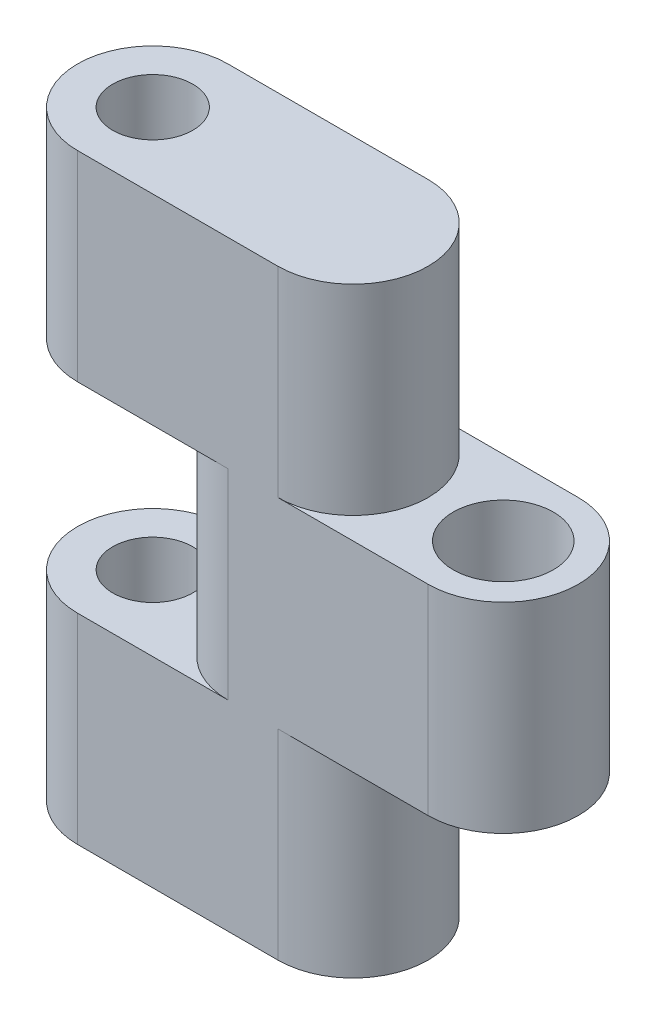
ISO-10303-21;
HEADER;
FILE_DESCRIPTION(('STEP AP214'),'2;1');
FILE_NAME('part.step','',(''),(''),'','','');
FILE_SCHEMA(('AUTOMOTIVE_DESIGN { 1 0 10303 214 1 1 1 1 }'));
ENDSEC;
DATA;
#1=APPLICATION_CONTEXT('core data for automotive mechanical design processes');
#2=APPLICATION_PROTOCOL_DEFINITION('international standard','automotive_design',2000,#1);
#3=PRODUCT_CONTEXT('',#1,'mechanical');
#4=PRODUCT('Part','Part','',(#3));
#5=PRODUCT_RELATED_PRODUCT_CATEGORY('part','',(#4));
#6=PRODUCT_DEFINITION_FORMATION('','',#4);
#7=PRODUCT_DEFINITION_CONTEXT('part definition',#1,'design');
#8=PRODUCT_DEFINITION('design','',#6,#7);
#9=PRODUCT_DEFINITION_SHAPE('','',#8);
#10=(LENGTH_UNIT() NAMED_UNIT(*) SI_UNIT(.MILLI.,.METRE.));
#11=(NAMED_UNIT(*) PLANE_ANGLE_UNIT() SI_UNIT($,.RADIAN.));
#12=(NAMED_UNIT(*) SI_UNIT($,.STERADIAN.) SOLID_ANGLE_UNIT());
#13=UNCERTAINTY_MEASURE_WITH_UNIT(LENGTH_MEASURE(1.E-05),#10,'distance_accuracy_value','');
#14=(GEOMETRIC_REPRESENTATION_CONTEXT(3) GLOBAL_UNCERTAINTY_ASSIGNED_CONTEXT((#13)) GLOBAL_UNIT_ASSIGNED_CONTEXT((#10,
#11,#12)) REPRESENTATION_CONTEXT('',''));
#15=CARTESIAN_POINT('',(0.,0.,0.));
#16=DIRECTION('',(0.,0.,1.));
#17=DIRECTION('',(1.,0.,0.));
#18=AXIS2_PLACEMENT_3D('',#15,#16,#17);
#19=CARTESIAN_POINT('',(0.,12.,1.5));
#20=DIRECTION('',(0.,-1.,0.));
#21=DIRECTION('',(0.,0.,-1.));
#22=AXIS2_PLACEMENT_3D('',#19,#20,#21);
#23=CYLINDRICAL_SURFACE('',#22,1.5);
#24=CARTESIAN_POINT('',(0.,8.,1.5));
#25=DIRECTION('',(0.,-1.,0.));
#26=DIRECTION('',(0.,0.,-1.));
#27=AXIS2_PLACEMENT_3D('',#24,#25,#26);
#28=CIRCLE('',#27,1.5);
#29=CARTESIAN_POINT('',(0.,8.,3.));
#30=VERTEX_POINT('',#29);
#31=CARTESIAN_POINT('',(0.,8.,0.));
#32=VERTEX_POINT('',#31);
#33=EDGE_CURVE('E138',#30,#32,#28,.T.);
#34=ORIENTED_EDGE('',*,*,#33,.F.);
#35=DIRECTION('',(0.,-1.,0.));
#36=VECTOR('',#35,1.);
#37=CARTESIAN_POINT('',(0.,12.,3.));
#38=LINE('',#37,#36);
#39=CARTESIAN_POINT('',(0.,12.,3.));
#40=VERTEX_POINT('',#39);
#41=EDGE_CURVE('E13',#40,#30,#38,.T.);
#42=ORIENTED_EDGE('',*,*,#41,.F.);
#43=CARTESIAN_POINT('',(0.,12.,1.5));
#44=DIRECTION('',(0.,1.,0.));
#45=DIRECTION('',(0.,0.,1.));
#46=AXIS2_PLACEMENT_3D('',#43,#44,#45);
#47=CIRCLE('',#46,1.5);
#48=CARTESIAN_POINT('',(0.,12.,0.));
#49=VERTEX_POINT('',#48);
#50=EDGE_CURVE('E161',#49,#40,#47,.T.);
#51=ORIENTED_EDGE('',*,*,#50,.F.);
#52=DIRECTION('',(0.,-1.,0.));
#53=VECTOR('',#52,1.);
#54=CARTESIAN_POINT('',(0.,12.,0.));
#55=LINE('',#54,#53);
#56=EDGE_CURVE('E148',#49,#32,#55,.T.);
#57=ORIENTED_EDGE('',*,*,#56,.T.);
#58=EDGE_LOOP('',(#34,#42,#51,#57));
#59=FACE_BOUND('',#58,.T.);
#60=ADVANCED_FACE('F46',(#59),#23,.T.);
#61=CARTESIAN_POINT('',(0.,12.,1.5));
#62=DIRECTION('',(0.,-1.,0.));
#63=DIRECTION('',(0.,0.,-1.));
#64=AXIS2_PLACEMENT_3D('',#61,#62,#63);
#65=CYLINDRICAL_SURFACE('',#64,0.8);
#66=CARTESIAN_POINT('',(0.,12.,1.5));
#67=DIRECTION('',(0.,1.,0.));
#68=DIRECTION('',(0.,0.,1.));
#69=AXIS2_PLACEMENT_3D('',#66,#67,#68);
#70=CIRCLE('',#69,0.8);
#71=CARTESIAN_POINT('',(0.,12.,2.3));
#72=VERTEX_POINT('',#71);
#73=EDGE_CURVE('E179',#72,#72,#70,.T.);
#74=ORIENTED_EDGE('',*,*,#73,.T.);
#75=EDGE_LOOP('',(#74));
#76=FACE_BOUND('',#75,.T.);
#77=CARTESIAN_POINT('',(0.,8.,1.5));
#78=DIRECTION('',(0.,-1.,0.));
#79=DIRECTION('',(0.,0.,-1.));
#80=AXIS2_PLACEMENT_3D('',#77,#78,#79);
#81=CIRCLE('',#80,0.8);
#82=CARTESIAN_POINT('',(0.,8.,0.7));
#83=VERTEX_POINT('',#82);
#84=EDGE_CURVE('E190',#83,#83,#81,.T.);
#85=ORIENTED_EDGE('',*,*,#84,.T.);
#86=EDGE_LOOP('',(#85));
#87=FACE_BOUND('',#86,.T.);
#88=ADVANCED_FACE('F251',(#76,#87),#65,.F.);
#89=CARTESIAN_POINT('',(7.,12.,1.5));
#90=DIRECTION('',(0.,-1.,0.));
#91=DIRECTION('',(0.,0.,-1.));
#92=AXIS2_PLACEMENT_3D('',#89,#90,#91);
#93=CYLINDRICAL_SURFACE('',#92,1.5);
#94=CARTESIAN_POINT('',(7.,8.,1.5));
#95=DIRECTION('',(0.,-1.,0.));
#96=DIRECTION('',(0.,0.,-1.));
#97=AXIS2_PLACEMENT_3D('',#94,#95,#96);
#98=CIRCLE('',#97,1.5);
#99=CARTESIAN_POINT('',(7.,8.,0.));
#100=VERTEX_POINT('',#99);
#101=CARTESIAN_POINT('',(7.,8.,3.));
#102=VERTEX_POINT('',#101);
#103=EDGE_CURVE('E209',#100,#102,#98,.T.);
#104=ORIENTED_EDGE('',*,*,#103,.T.);
#105=DIRECTION('',(0.,-1.,0.));
#106=VECTOR('',#105,1.);
#107=CARTESIAN_POINT('',(7.,12.,3.));
#108=LINE('',#107,#106);
#109=CARTESIAN_POINT('',(7.,4.,3.));
#110=VERTEX_POINT('',#109);
#111=EDGE_CURVE('E185',#102,#110,#108,.T.);
#112=ORIENTED_EDGE('',*,*,#111,.T.);
#113=CARTESIAN_POINT('',(7.,4.,1.5));
#114=DIRECTION('',(0.,-1.,0.));
#115=DIRECTION('',(0.,0.,-1.));
#116=AXIS2_PLACEMENT_3D('',#113,#114,#115);
#117=CIRCLE('',#116,1.5);
#118=CARTESIAN_POINT('',(7.,4.,0.));
#119=VERTEX_POINT('',#118);
#120=EDGE_CURVE('E228',#119,#110,#117,.T.);
#121=ORIENTED_EDGE('',*,*,#120,.F.);
#122=DIRECTION('',(0.,-1.,0.));
#123=VECTOR('',#122,1.);
#124=CARTESIAN_POINT('',(7.,12.,0.));
#125=LINE('',#124,#123);
#126=EDGE_CURVE('E183',#100,#119,#125,.T.);
#127=ORIENTED_EDGE('',*,*,#126,.F.);
#128=EDGE_LOOP('',(#104,#112,#121,#127));
#129=FACE_BOUND('',#128,.T.);
#130=ADVANCED_FACE('F263',(#129),#93,.T.);
#131=CARTESIAN_POINT('',(0.,12.,0.));
#132=DIRECTION('',(0.,0.,1.));
#133=DIRECTION('',(1.,0.,0.));
#134=AXIS2_PLACEMENT_3D('',#131,#132,#133);
#135=PLANE('',#134);
#136=CARTESIAN_POINT('',(0.,4.,0.));
#137=VERTEX_POINT('',#136);
#138=CARTESIAN_POINT('',(0.,0.,0.));
#139=VERTEX_POINT('',#138);
#140=EDGE_CURVE('E175',#137,#139,#55,.T.);
#141=ORIENTED_EDGE('',*,*,#140,.F.);
#142=DIRECTION('',(1.,0.,0.));
#143=VECTOR('',#142,1.);
#144=CARTESIAN_POINT('',(0.,4.,0.));
#145=LINE('',#144,#143);
#146=CARTESIAN_POINT('',(3.,4.,0.));
#147=VERTEX_POINT('',#146);
#148=EDGE_CURVE('E202',#137,#147,#145,.T.);
#149=ORIENTED_EDGE('',*,*,#148,.T.);
#150=DIRECTION('',(0.,1.,0.));
#151=VECTOR('',#150,1.);
#152=CARTESIAN_POINT('',(3.,4.,0.));
#153=LINE('',#152,#151);
#154=CARTESIAN_POINT('',(3.,8.,0.));
#155=VERTEX_POINT('',#154);
#156=EDGE_CURVE('E197',#147,#155,#153,.T.);
#157=ORIENTED_EDGE('',*,*,#156,.T.);
#158=DIRECTION('',(1.,0.,0.));
#159=VECTOR('',#158,1.);
#160=CARTESIAN_POINT('',(0.,8.,0.));
#161=LINE('',#160,#159);
#162=EDGE_CURVE('E149',#32,#155,#161,.T.);
#163=ORIENTED_EDGE('',*,*,#162,.F.);
#164=ORIENTED_EDGE('',*,*,#56,.F.);
#165=DIRECTION('',(-1.,0.,0.));
#166=VECTOR('',#165,1.);
#167=CARTESIAN_POINT('',(0.,12.,0.));
#168=LINE('',#167,#166);
#169=CARTESIAN_POINT('',(4.,12.,0.));
#170=VERTEX_POINT('',#169);
#171=EDGE_CURVE('E160',#170,#49,#168,.T.);
#172=ORIENTED_EDGE('',*,*,#171,.F.);
#173=DIRECTION('',(0.,1.,0.));
#174=VECTOR('',#173,1.);
#175=CARTESIAN_POINT('',(4.,8.,0.));
#176=LINE('',#175,#174);
#177=CARTESIAN_POINT('',(4.,8.,0.));
#178=VERTEX_POINT('',#177);
#179=EDGE_CURVE('E216',#178,#170,#176,.T.);
#180=ORIENTED_EDGE('',*,*,#179,.F.);
#181=DIRECTION('',(1.,0.,0.));
#182=VECTOR('',#181,1.);
#183=CARTESIAN_POINT('',(7.,8.,0.));
#184=LINE('',#183,#182);
#185=EDGE_CURVE('E212',#178,#100,#184,.T.);
#186=ORIENTED_EDGE('',*,*,#185,.T.);
#187=ORIENTED_EDGE('',*,*,#126,.T.);
#188=DIRECTION('',(1.,0.,0.));
#189=VECTOR('',#188,1.);
#190=CARTESIAN_POINT('',(7.,4.,0.));
#191=LINE('',#190,#189);
#192=CARTESIAN_POINT('',(4.,4.,0.));
#193=VERTEX_POINT('',#192);
#194=EDGE_CURVE('E225',#193,#119,#191,.T.);
#195=ORIENTED_EDGE('',*,*,#194,.F.);
#196=DIRECTION('',(0.,-1.,0.));
#197=VECTOR('',#196,1.);
#198=CARTESIAN_POINT('',(4.,4.,0.));
#199=LINE('',#198,#197);
#200=CARTESIAN_POINT('',(4.,0.,0.));
#201=VERTEX_POINT('',#200);
#202=EDGE_CURVE('E234',#193,#201,#199,.T.);
#203=ORIENTED_EDGE('',*,*,#202,.T.);
#204=DIRECTION('',(-1.,0.,0.));
#205=VECTOR('',#204,1.);
#206=CARTESIAN_POINT('',(0.,0.,0.));
#207=LINE('',#206,#205);
#208=EDGE_CURVE('E165',#201,#139,#207,.T.);
#209=ORIENTED_EDGE('',*,*,#208,.T.);
#210=EDGE_LOOP('',(#141,#149,#157,#163,#164,#172,#180,#186,#187,#195,#203,#209));
#211=FACE_BOUND('',#210,.T.);
#212=ADVANCED_FACE('F288',(#211),#135,.F.);
#213=CARTESIAN_POINT('',(7.,12.,1.5));
#214=DIRECTION('',(0.,-1.,0.));
#215=DIRECTION('',(0.,0.,-1.));
#216=AXIS2_PLACEMENT_3D('',#213,#214,#215);
#217=CYLINDRICAL_SURFACE('',#216,1.);
#218=CARTESIAN_POINT('',(7.,4.,1.5));
#219=DIRECTION('',(0.,-1.,0.));
#220=DIRECTION('',(0.,0.,-1.));
#221=AXIS2_PLACEMENT_3D('',#218,#219,#220);
#222=CIRCLE('',#221,1.);
#223=CARTESIAN_POINT('',(7.,4.,0.499999999999999));
#224=VERTEX_POINT('',#223);
#225=EDGE_CURVE('E187',#224,#224,#222,.T.);
#226=ORIENTED_EDGE('',*,*,#225,.T.);
#227=EDGE_LOOP('',(#226));
#228=FACE_BOUND('',#227,.T.);
#229=CARTESIAN_POINT('',(7.,8.,1.5));
#230=DIRECTION('',(0.,1.,0.));
#231=DIRECTION('',(0.,0.,1.));
#232=AXIS2_PLACEMENT_3D('',#229,#230,#231);
#233=CIRCLE('',#232,1.);
#234=CARTESIAN_POINT('',(7.,8.,2.5));
#235=VERTEX_POINT('',#234);
#236=EDGE_CURVE('E218',#235,#235,#233,.T.);
#237=ORIENTED_EDGE('',*,*,#236,.T.);
#238=EDGE_LOOP('',(#237));
#239=FACE_BOUND('',#238,.T.);
#240=ADVANCED_FACE('F311',(#228,#239),#217,.F.);
#241=CARTESIAN_POINT('',(0.,12.,1.5));
#242=DIRECTION('',(0.,1.,0.));
#243=DIRECTION('',(0.,0.,1.));
#244=AXIS2_PLACEMENT_3D('',#241,#242,#243);
#245=PLANE('',#244);
#246=ORIENTED_EDGE('',*,*,#73,.F.);
#247=EDGE_LOOP('',(#246));
#248=FACE_BOUND('',#247,.T.);
#249=DIRECTION('',(1.,0.,0.));
#250=VECTOR('',#249,1.);
#251=CARTESIAN_POINT('',(0.,12.,3.));
#252=LINE('',#251,#250);
#253=CARTESIAN_POINT('',(4.,12.,3.));
#254=VERTEX_POINT('',#253);
#255=EDGE_CURVE('E154',#40,#254,#252,.T.);
#256=ORIENTED_EDGE('',*,*,#255,.T.);
#257=CARTESIAN_POINT('',(4.,12.,1.5));
#258=DIRECTION('',(0.,1.,0.));
#259=DIRECTION('',(0.,0.,-1.));
#260=AXIS2_PLACEMENT_3D('',#257,#258,#259);
#261=CIRCLE('',#260,1.5);
#262=EDGE_CURVE('E196',#254,#170,#261,.T.);
#263=ORIENTED_EDGE('',*,*,#262,.T.);
#264=ORIENTED_EDGE('',*,*,#171,.T.);
#265=ORIENTED_EDGE('',*,*,#50,.T.);
#266=EDGE_LOOP('',(#256,#263,#264,#265));
#267=FACE_BOUND('',#266,.T.);
#268=ADVANCED_FACE('F163',(#248,#267),#245,.T.);
#269=CARTESIAN_POINT('',(0.,0.,1.5));
#270=DIRECTION('',(0.,1.,0.));
#271=DIRECTION('',(0.,0.,1.));
#272=AXIS2_PLACEMENT_3D('',#269,#270,#271);
#273=PLANE('',#272);
#274=ORIENTED_EDGE('',*,*,#208,.F.);
#275=CARTESIAN_POINT('',(4.,0.,1.5));
#276=DIRECTION('',(0.,1.,0.));
#277=DIRECTION('',(0.,0.,-1.));
#278=AXIS2_PLACEMENT_3D('',#275,#276,#277);
#279=CIRCLE('',#278,1.5);
#280=CARTESIAN_POINT('',(4.,0.,3.));
#281=VERTEX_POINT('',#280);
#282=EDGE_CURVE('E222',#281,#201,#279,.T.);
#283=ORIENTED_EDGE('',*,*,#282,.F.);
#284=DIRECTION('',(1.,0.,0.));
#285=VECTOR('',#284,1.);
#286=CARTESIAN_POINT('',(0.,0.,3.));
#287=LINE('',#286,#285);
#288=CARTESIAN_POINT('',(0.,0.,3.));
#289=VERTEX_POINT('',#288);
#290=EDGE_CURVE('E168',#289,#281,#287,.T.);
#291=ORIENTED_EDGE('',*,*,#290,.F.);
#292=CARTESIAN_POINT('',(0.,0.,1.5));
#293=DIRECTION('',(0.,1.,0.));
#294=DIRECTION('',(0.,0.,1.));
#295=AXIS2_PLACEMENT_3D('',#292,#293,#294);
#296=CIRCLE('',#295,1.5);
#297=EDGE_CURVE('E176',#139,#289,#296,.T.);
#298=ORIENTED_EDGE('',*,*,#297,.F.);
#299=EDGE_LOOP('',(#274,#283,#291,#298));
#300=FACE_BOUND('',#299,.T.);
#301=CARTESIAN_POINT('',(0.,0.,1.5));
#302=DIRECTION('',(0.,1.,0.));
#303=DIRECTION('',(0.,0.,1.));
#304=AXIS2_PLACEMENT_3D('',#301,#302,#303);
#305=CIRCLE('',#304,0.8);
#306=CARTESIAN_POINT('',(0.,0.,2.3));
#307=VERTEX_POINT('',#306);
#308=EDGE_CURVE('E171',#307,#307,#305,.T.);
#309=ORIENTED_EDGE('',*,*,#308,.T.);
#310=EDGE_LOOP('',(#309));
#311=FACE_BOUND('',#310,.T.);
#312=ADVANCED_FACE('F244',(#300,#311),#273,.F.);
#313=CARTESIAN_POINT('',(0.,4.,3.));
#314=VERTEX_POINT('',#313);
#315=EDGE_CURVE('E55',#314,#289,#38,.T.);
#316=ORIENTED_EDGE('',*,*,#315,.F.);
#317=CARTESIAN_POINT('',(0.,4.,1.5));
#318=DIRECTION('',(0.,-1.,0.));
#319=DIRECTION('',(0.,0.,-1.));
#320=AXIS2_PLACEMENT_3D('',#317,#318,#319);
#321=CIRCLE('',#320,1.5);
#322=EDGE_CURVE('E276',#314,#137,#321,.T.);
#323=ORIENTED_EDGE('',*,*,#322,.T.);
#324=ORIENTED_EDGE('',*,*,#140,.T.);
#325=ORIENTED_EDGE('',*,*,#297,.T.);
#326=EDGE_LOOP('',(#316,#323,#324,#325));
#327=FACE_BOUND('',#326,.T.);
#328=ADVANCED_FACE('F48',(#327),#23,.T.);
#329=CARTESIAN_POINT('',(0.,12.,3.));
#330=DIRECTION('',(0.,0.,-1.));
#331=DIRECTION('',(-1.,0.,0.));
#332=AXIS2_PLACEMENT_3D('',#329,#330,#331);
#333=PLANE('',#332);
#334=DIRECTION('',(0.,1.,0.));
#335=VECTOR('',#334,1.);
#336=CARTESIAN_POINT('',(3.,4.,3.));
#337=LINE('',#336,#335);
#338=CARTESIAN_POINT('',(3.,4.,3.));
#339=VERTEX_POINT('',#338);
#340=CARTESIAN_POINT('',(3.,8.,3.));
#341=VERTEX_POINT('',#340);
#342=EDGE_CURVE('E192',#339,#341,#337,.T.);
#343=ORIENTED_EDGE('',*,*,#342,.F.);
#344=DIRECTION('',(-1.,0.,0.));
#345=VECTOR('',#344,1.);
#346=CARTESIAN_POINT('',(0.,4.,3.));
#347=LINE('',#346,#345);
#348=EDGE_CURVE('E282',#339,#314,#347,.T.);
#349=ORIENTED_EDGE('',*,*,#348,.T.);
#350=ORIENTED_EDGE('',*,*,#315,.T.);
#351=ORIENTED_EDGE('',*,*,#290,.T.);
#352=DIRECTION('',(0.,-1.,0.));
#353=VECTOR('',#352,1.);
#354=CARTESIAN_POINT('',(4.,4.,3.));
#355=LINE('',#354,#353);
#356=CARTESIAN_POINT('',(4.,4.,3.));
#357=VERTEX_POINT('',#356);
#358=EDGE_CURVE('E189',#357,#281,#355,.T.);
#359=ORIENTED_EDGE('',*,*,#358,.F.);
#360=DIRECTION('',(-1.,0.,0.));
#361=VECTOR('',#360,1.);
#362=CARTESIAN_POINT('',(7.,4.,3.));
#363=LINE('',#362,#361);
#364=EDGE_CURVE('E231',#110,#357,#363,.T.);
#365=ORIENTED_EDGE('',*,*,#364,.F.);
#366=ORIENTED_EDGE('',*,*,#111,.F.);
#367=DIRECTION('',(-1.,0.,0.));
#368=VECTOR('',#367,1.);
#369=CARTESIAN_POINT('',(7.,8.,3.));
#370=LINE('',#369,#368);
#371=CARTESIAN_POINT('',(4.,8.,3.));
#372=VERTEX_POINT('',#371);
#373=EDGE_CURVE('E207',#102,#372,#370,.T.);
#374=ORIENTED_EDGE('',*,*,#373,.T.);
#375=DIRECTION('',(0.,1.,0.));
#376=VECTOR('',#375,1.);
#377=CARTESIAN_POINT('',(4.,8.,3.));
#378=LINE('',#377,#376);
#379=EDGE_CURVE('E157',#372,#254,#378,.T.);
#380=ORIENTED_EDGE('',*,*,#379,.T.);
#381=ORIENTED_EDGE('',*,*,#255,.F.);
#382=ORIENTED_EDGE('',*,*,#41,.T.);
#383=DIRECTION('',(-1.,0.,0.));
#384=VECTOR('',#383,1.);
#385=CARTESIAN_POINT('',(0.,8.,3.));
#386=LINE('',#385,#384);
#387=EDGE_CURVE('E135',#341,#30,#386,.T.);
#388=ORIENTED_EDGE('',*,*,#387,.F.);
#389=EDGE_LOOP('',(#343,#349,#350,#351,#359,#365,#366,#374,#380,#381,#382,#388));
#390=FACE_BOUND('',#389,.T.);
#391=ADVANCED_FACE('F151',(#390),#333,.F.);
#392=CARTESIAN_POINT('',(0.,4.,1.5));
#393=DIRECTION('',(0.,-1.,0.));
#394=DIRECTION('',(0.,0.,-1.));
#395=AXIS2_PLACEMENT_3D('',#392,#393,#394);
#396=CIRCLE('',#395,0.8);
#397=CARTESIAN_POINT('',(0.,4.,0.7));
#398=VERTEX_POINT('',#397);
#399=EDGE_CURVE('E50',#398,#398,#396,.T.);
#400=ORIENTED_EDGE('',*,*,#399,.F.);
#401=EDGE_LOOP('',(#400));
#402=FACE_BOUND('',#401,.T.);
#403=ORIENTED_EDGE('',*,*,#308,.F.);
#404=EDGE_LOOP('',(#403));
#405=FACE_BOUND('',#404,.T.);
#406=ADVANCED_FACE('F246',(#402,#405),#65,.F.);
#407=CARTESIAN_POINT('',(4.,4.,1.5));
#408=DIRECTION('',(0.,-1.,0.));
#409=DIRECTION('',(0.,0.,-1.));
#410=AXIS2_PLACEMENT_3D('',#407,#408,#409);
#411=CYLINDRICAL_SURFACE('',#410,1.5);
#412=ORIENTED_EDGE('',*,*,#282,.T.);
#413=ORIENTED_EDGE('',*,*,#202,.F.);
#414=CARTESIAN_POINT('',(4.,4.,1.5));
#415=DIRECTION('',(0.,1.,0.));
#416=DIRECTION('',(0.,0.,-1.));
#417=AXIS2_PLACEMENT_3D('',#414,#415,#416);
#418=CIRCLE('',#417,1.5);
#419=EDGE_CURVE('E223',#357,#193,#418,.T.);
#420=ORIENTED_EDGE('',*,*,#419,.F.);
#421=ORIENTED_EDGE('',*,*,#358,.T.);
#422=EDGE_LOOP('',(#412,#413,#420,#421));
#423=FACE_BOUND('',#422,.T.);
#424=ADVANCED_FACE('F248',(#423),#411,.T.);
#425=CARTESIAN_POINT('',(4.,4.,1.5));
#426=DIRECTION('',(0.,-1.,0.));
#427=DIRECTION('',(0.,0.,-1.));
#428=AXIS2_PLACEMENT_3D('',#425,#426,#427);
#429=PLANE('',#428);
#430=ORIENTED_EDGE('',*,*,#225,.F.);
#431=EDGE_LOOP('',(#430));
#432=FACE_BOUND('',#431,.T.);
#433=ORIENTED_EDGE('',*,*,#419,.T.);
#434=ORIENTED_EDGE('',*,*,#194,.T.);
#435=ORIENTED_EDGE('',*,*,#120,.T.);
#436=ORIENTED_EDGE('',*,*,#364,.T.);
#437=EDGE_LOOP('',(#433,#434,#435,#436));
#438=FACE_BOUND('',#437,.T.);
#439=ADVANCED_FACE('F256',(#432,#438),#429,.T.);
#440=CARTESIAN_POINT('',(4.,8.,1.5));
#441=DIRECTION('',(0.,1.,0.));
#442=DIRECTION('',(0.,0.,1.));
#443=AXIS2_PLACEMENT_3D('',#440,#441,#442);
#444=CYLINDRICAL_SURFACE('',#443,1.5);
#445=ORIENTED_EDGE('',*,*,#262,.F.);
#446=ORIENTED_EDGE('',*,*,#379,.F.);
#447=CARTESIAN_POINT('',(4.,8.,1.5));
#448=DIRECTION('',(0.,1.,0.));
#449=DIRECTION('',(0.,0.,-1.));
#450=AXIS2_PLACEMENT_3D('',#447,#448,#449);
#451=CIRCLE('',#450,1.5);
#452=EDGE_CURVE('E71',#372,#178,#451,.T.);
#453=ORIENTED_EDGE('',*,*,#452,.T.);
#454=ORIENTED_EDGE('',*,*,#179,.T.);
#455=EDGE_LOOP('',(#445,#446,#453,#454));
#456=FACE_BOUND('',#455,.T.);
#457=ADVANCED_FACE('F298',(#456),#444,.T.);
#458=CARTESIAN_POINT('',(4.,8.,1.5));
#459=DIRECTION('',(0.,1.,0.));
#460=DIRECTION('',(0.,0.,-1.));
#461=AXIS2_PLACEMENT_3D('',#458,#459,#460);
#462=PLANE('',#461);
#463=ORIENTED_EDGE('',*,*,#236,.F.);
#464=EDGE_LOOP('',(#463));
#465=FACE_BOUND('',#464,.T.);
#466=ORIENTED_EDGE('',*,*,#452,.F.);
#467=ORIENTED_EDGE('',*,*,#373,.F.);
#468=ORIENTED_EDGE('',*,*,#103,.F.);
#469=ORIENTED_EDGE('',*,*,#185,.F.);
#470=EDGE_LOOP('',(#466,#467,#468,#469));
#471=FACE_BOUND('',#470,.T.);
#472=ADVANCED_FACE('F295',(#465,#471),#462,.T.);
#473=CARTESIAN_POINT('',(3.,4.,1.5));
#474=DIRECTION('',(0.,1.,0.));
#475=DIRECTION('',(0.,0.,1.));
#476=AXIS2_PLACEMENT_3D('',#473,#474,#475);
#477=CYLINDRICAL_SURFACE('',#476,1.5);
#478=ORIENTED_EDGE('',*,*,#156,.F.);
#479=CARTESIAN_POINT('',(3.,4.,1.5));
#480=DIRECTION('',(0.,1.,0.));
#481=DIRECTION('',(0.,0.,-1.));
#482=AXIS2_PLACEMENT_3D('',#479,#480,#481);
#483=CIRCLE('',#482,1.5);
#484=EDGE_CURVE('E391',#147,#339,#483,.T.);
#485=ORIENTED_EDGE('',*,*,#484,.T.);
#486=ORIENTED_EDGE('',*,*,#342,.T.);
#487=CARTESIAN_POINT('',(3.,8.,1.5));
#488=DIRECTION('',(0.,1.,0.));
#489=DIRECTION('',(0.,0.,-1.));
#490=AXIS2_PLACEMENT_3D('',#487,#488,#489);
#491=CIRCLE('',#490,1.5);
#492=EDGE_CURVE('E63',#155,#341,#491,.T.);
#493=ORIENTED_EDGE('',*,*,#492,.F.);
#494=EDGE_LOOP('',(#478,#485,#486,#493));
#495=FACE_BOUND('',#494,.T.);
#496=ADVANCED_FACE('F305',(#495),#477,.T.);
#497=CARTESIAN_POINT('',(3.,4.,1.5));
#498=DIRECTION('',(0.,-1.,0.));
#499=DIRECTION('',(0.,0.,-1.));
#500=AXIS2_PLACEMENT_3D('',#497,#498,#499);
#501=PLANE('',#500);
#502=ORIENTED_EDGE('',*,*,#399,.T.);
#503=EDGE_LOOP('',(#502));
#504=FACE_BOUND('',#503,.T.);
#505=ORIENTED_EDGE('',*,*,#484,.F.);
#506=ORIENTED_EDGE('',*,*,#148,.F.);
#507=ORIENTED_EDGE('',*,*,#322,.F.);
#508=ORIENTED_EDGE('',*,*,#348,.F.);
#509=EDGE_LOOP('',(#505,#506,#507,#508));
#510=FACE_BOUND('',#509,.T.);
#511=ADVANCED_FACE('F368',(#504,#510),#501,.F.);
#512=CARTESIAN_POINT('',(3.,8.,1.5));
#513=DIRECTION('',(0.,-1.,0.));
#514=DIRECTION('',(0.,0.,-1.));
#515=AXIS2_PLACEMENT_3D('',#512,#513,#514);
#516=PLANE('',#515);
#517=ORIENTED_EDGE('',*,*,#84,.F.);
#518=EDGE_LOOP('',(#517));
#519=FACE_BOUND('',#518,.T.);
#520=ORIENTED_EDGE('',*,*,#492,.T.);
#521=ORIENTED_EDGE('',*,*,#387,.T.);
#522=ORIENTED_EDGE('',*,*,#33,.T.);
#523=ORIENTED_EDGE('',*,*,#162,.T.);
#524=EDGE_LOOP('',(#520,#521,#522,#523));
#525=FACE_BOUND('',#524,.T.);
#526=ADVANCED_FACE('F137',(#519,#525),#516,.T.);
#527=CLOSED_SHELL('',(#60,#88,#130,#212,#240,#268,#312,#328,#391,#406,#424,#439,#457,#472,#496,
#511,#526));
#528=MANIFOLD_SOLID_BREP('B2',#527);
#529=ADVANCED_BREP_SHAPE_REPRESENTATION('',(#18,#528),#14);
#530=SHAPE_DEFINITION_REPRESENTATION(#9,#529);
ENDSEC;
END-ISO-10303-21;
